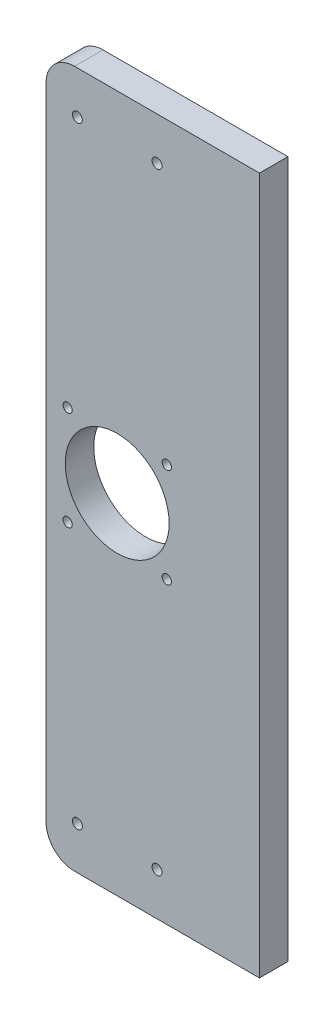
ISO-10303-21;
HEADER;
FILE_DESCRIPTION(('STEP AP214'),'2;1');
FILE_NAME('part.step','',(''),(''),'','','');
FILE_SCHEMA(('AUTOMOTIVE_DESIGN { 1 0 10303 214 1 1 1 1 }'));
ENDSEC;
DATA;
#1=APPLICATION_CONTEXT('core data for automotive mechanical design processes');
#2=APPLICATION_PROTOCOL_DEFINITION('international standard','automotive_design',2000,#1);
#3=PRODUCT_CONTEXT('',#1,'mechanical');
#4=PRODUCT('Part','Part','',(#3));
#5=PRODUCT_RELATED_PRODUCT_CATEGORY('part','',(#4));
#6=PRODUCT_DEFINITION_FORMATION('','',#4);
#7=PRODUCT_DEFINITION_CONTEXT('part definition',#1,'design');
#8=PRODUCT_DEFINITION('design','',#6,#7);
#9=PRODUCT_DEFINITION_SHAPE('','',#8);
#10=(LENGTH_UNIT() NAMED_UNIT(*) SI_UNIT(.MILLI.,.METRE.));
#11=(NAMED_UNIT(*) PLANE_ANGLE_UNIT() SI_UNIT($,.RADIAN.));
#12=(NAMED_UNIT(*) SI_UNIT($,.STERADIAN.) SOLID_ANGLE_UNIT());
#13=UNCERTAINTY_MEASURE_WITH_UNIT(LENGTH_MEASURE(1.E-05),#10,'distance_accuracy_value','');
#14=(GEOMETRIC_REPRESENTATION_CONTEXT(3) GLOBAL_UNCERTAINTY_ASSIGNED_CONTEXT((#13)) GLOBAL_UNIT_ASSIGNED_CONTEXT((#10,
#11,#12)) REPRESENTATION_CONTEXT('',''));
#15=CARTESIAN_POINT('',(0.,0.,0.));
#16=DIRECTION('',(0.,0.,1.));
#17=DIRECTION('',(1.,0.,0.));
#18=AXIS2_PLACEMENT_3D('',#15,#16,#17);
#19=CARTESIAN_POINT('',(100.,0.,20.));
#20=DIRECTION('',(1.,0.,0.));
#21=DIRECTION('',(0.,0.,-1.));
#22=AXIS2_PLACEMENT_3D('',#19,#20,#21);
#23=PLANE('',#22);
#24=DIRECTION('',(0.,-1.,0.));
#25=VECTOR('',#24,1.);
#26=CARTESIAN_POINT('',(100.,0.,0.));
#27=LINE('',#26,#25);
#28=CARTESIAN_POINT('',(100.,245.,0.));
#29=VERTEX_POINT('',#28);
#30=CARTESIAN_POINT('',(100.,-245.,0.));
#31=VERTEX_POINT('',#30);
#32=EDGE_CURVE('E104',#29,#31,#27,.T.);
#33=ORIENTED_EDGE('',*,*,#32,.F.);
#34=DIRECTION('',(0.,0.,-1.));
#35=VECTOR('',#34,1.);
#36=CARTESIAN_POINT('',(100.,245.,20.));
#37=LINE('',#36,#35);
#38=CARTESIAN_POINT('',(100.,245.,20.));
#39=VERTEX_POINT('',#38);
#40=EDGE_CURVE('E92',#39,#29,#37,.T.);
#41=ORIENTED_EDGE('',*,*,#40,.F.);
#42=DIRECTION('',(0.,-1.,0.));
#43=VECTOR('',#42,1.);
#44=CARTESIAN_POINT('',(100.,0.,20.));
#45=LINE('',#44,#43);
#46=CARTESIAN_POINT('',(100.,-245.,20.));
#47=VERTEX_POINT('',#46);
#48=EDGE_CURVE('E98',#39,#47,#45,.T.);
#49=ORIENTED_EDGE('',*,*,#48,.T.);
#50=DIRECTION('',(0.,0.,-1.));
#51=VECTOR('',#50,1.);
#52=CARTESIAN_POINT('',(100.,-245.,20.));
#53=LINE('',#52,#51);
#54=EDGE_CURVE('E106',#47,#31,#53,.T.);
#55=ORIENTED_EDGE('',*,*,#54,.T.);
#56=EDGE_LOOP('',(#33,#41,#49,#55));
#57=FACE_BOUND('',#56,.T.);
#58=ADVANCED_FACE('F37',(#57),#23,.T.);
#59=CARTESIAN_POINT('',(0.,245.,20.));
#60=DIRECTION('',(0.,1.,0.));
#61=DIRECTION('',(0.,0.,1.));
#62=AXIS2_PLACEMENT_3D('',#59,#60,#61);
#63=PLANE('',#62);
#64=DIRECTION('',(1.,0.,0.));
#65=VECTOR('',#64,1.);
#66=CARTESIAN_POINT('',(0.,245.,0.));
#67=LINE('',#66,#65);
#68=CARTESIAN_POINT('',(-30.,245.,0.));
#69=VERTEX_POINT('',#68);
#70=EDGE_CURVE('E150',#69,#29,#67,.T.);
#71=ORIENTED_EDGE('',*,*,#70,.F.);
#72=DIRECTION('',(0.,0.,-1.));
#73=VECTOR('',#72,1.);
#74=CARTESIAN_POINT('',(-30.,245.,20.));
#75=LINE('',#74,#73);
#76=CARTESIAN_POINT('',(-30.,245.,20.));
#77=VERTEX_POINT('',#76);
#78=EDGE_CURVE('E11',#69,#77,#75,.F.);
#79=ORIENTED_EDGE('',*,*,#78,.T.);
#80=DIRECTION('',(1.,0.,0.));
#81=VECTOR('',#80,1.);
#82=CARTESIAN_POINT('',(0.,245.,20.));
#83=LINE('',#82,#81);
#84=EDGE_CURVE('E89',#77,#39,#83,.T.);
#85=ORIENTED_EDGE('',*,*,#84,.T.);
#86=ORIENTED_EDGE('',*,*,#40,.T.);
#87=EDGE_LOOP('',(#71,#79,#85,#86));
#88=FACE_BOUND('',#87,.T.);
#89=ADVANCED_FACE('F91',(#88),#63,.T.);
#90=CARTESIAN_POINT('',(-50.,0.,20.));
#91=DIRECTION('',(1.,0.,0.));
#92=DIRECTION('',(0.,0.,-1.));
#93=AXIS2_PLACEMENT_3D('',#90,#91,#92);
#94=PLANE('',#93);
#95=DIRECTION('',(0.,-1.,0.));
#96=VECTOR('',#95,1.);
#97=CARTESIAN_POINT('',(-50.,0.,0.));
#98=LINE('',#97,#96);
#99=CARTESIAN_POINT('',(-50.,225.,0.));
#100=VERTEX_POINT('',#99);
#101=CARTESIAN_POINT('',(-50.,-225.,0.));
#102=VERTEX_POINT('',#101);
#103=EDGE_CURVE('E152',#100,#102,#98,.T.);
#104=ORIENTED_EDGE('',*,*,#103,.T.);
#105=DIRECTION('',(0.,0.,-1.));
#106=VECTOR('',#105,1.);
#107=CARTESIAN_POINT('',(-50.,-225.,20.));
#108=LINE('',#107,#106);
#109=CARTESIAN_POINT('',(-50.,-225.,20.));
#110=VERTEX_POINT('',#109);
#111=EDGE_CURVE('E58',#102,#110,#108,.F.);
#112=ORIENTED_EDGE('',*,*,#111,.T.);
#113=DIRECTION('',(0.,-1.,0.));
#114=VECTOR('',#113,1.);
#115=CARTESIAN_POINT('',(-50.,0.,20.));
#116=LINE('',#115,#114);
#117=CARTESIAN_POINT('',(-50.,225.,20.));
#118=VERTEX_POINT('',#117);
#119=EDGE_CURVE('E97',#118,#110,#116,.T.);
#120=ORIENTED_EDGE('',*,*,#119,.F.);
#121=DIRECTION('',(0.,0.,-1.));
#122=VECTOR('',#121,1.);
#123=CARTESIAN_POINT('',(-50.,225.,0.));
#124=LINE('',#123,#122);
#125=EDGE_CURVE('E170',#118,#100,#124,.T.);
#126=ORIENTED_EDGE('',*,*,#125,.T.);
#127=EDGE_LOOP('',(#104,#112,#120,#126));
#128=FACE_BOUND('',#127,.T.);
#129=ADVANCED_FACE('F186',(#128),#94,.F.);
#130=CARTESIAN_POINT('',(28.,-215.,20.));
#131=DIRECTION('',(0.,0.,-1.));
#132=DIRECTION('',(-1.,0.,0.));
#133=AXIS2_PLACEMENT_3D('',#130,#131,#132);
#134=CYLINDRICAL_SURFACE('',#133,3.5);
#135=CARTESIAN_POINT('',(28.,-215.,20.));
#136=DIRECTION('',(0.,0.,1.));
#137=DIRECTION('',(1.,0.,0.));
#138=AXIS2_PLACEMENT_3D('',#135,#136,#137);
#139=CIRCLE('',#138,3.5);
#140=CARTESIAN_POINT('',(31.5,-215.,20.));
#141=VERTEX_POINT('',#140);
#142=EDGE_CURVE('E122',#141,#141,#139,.T.);
#143=ORIENTED_EDGE('',*,*,#142,.T.);
#144=EDGE_LOOP('',(#143));
#145=FACE_BOUND('',#144,.T.);
#146=CARTESIAN_POINT('',(28.,-215.,0.));
#147=DIRECTION('',(0.,0.,1.));
#148=DIRECTION('',(1.,0.,0.));
#149=AXIS2_PLACEMENT_3D('',#146,#147,#148);
#150=CIRCLE('',#149,3.5);
#151=CARTESIAN_POINT('',(31.5,-215.,0.));
#152=VERTEX_POINT('',#151);
#153=EDGE_CURVE('E156',#152,#152,#150,.T.);
#154=ORIENTED_EDGE('',*,*,#153,.F.);
#155=EDGE_LOOP('',(#154));
#156=FACE_BOUND('',#155,.T.);
#157=ADVANCED_FACE('F265',(#145,#156),#134,.F.);
#158=CARTESIAN_POINT('',(0.,-245.,20.));
#159=DIRECTION('',(0.,1.,0.));
#160=DIRECTION('',(0.,0.,1.));
#161=AXIS2_PLACEMENT_3D('',#158,#159,#160);
#162=PLANE('',#161);
#163=DIRECTION('',(1.,0.,0.));
#164=VECTOR('',#163,1.);
#165=CARTESIAN_POINT('',(0.,-245.,20.));
#166=LINE('',#165,#164);
#167=CARTESIAN_POINT('',(-30.,-245.,20.));
#168=VERTEX_POINT('',#167);
#169=EDGE_CURVE('E111',#168,#47,#166,.T.);
#170=ORIENTED_EDGE('',*,*,#169,.F.);
#171=DIRECTION('',(0.,0.,-1.));
#172=VECTOR('',#171,1.);
#173=CARTESIAN_POINT('',(-30.,-245.,20.));
#174=LINE('',#173,#172);
#175=CARTESIAN_POINT('',(-30.,-245.,0.));
#176=VERTEX_POINT('',#175);
#177=EDGE_CURVE('E105',#168,#176,#174,.T.);
#178=ORIENTED_EDGE('',*,*,#177,.T.);
#179=DIRECTION('',(1.,0.,0.));
#180=VECTOR('',#179,1.);
#181=CARTESIAN_POINT('',(0.,-245.,0.));
#182=LINE('',#181,#180);
#183=EDGE_CURVE('E154',#176,#31,#182,.T.);
#184=ORIENTED_EDGE('',*,*,#183,.T.);
#185=ORIENTED_EDGE('',*,*,#54,.F.);
#186=EDGE_LOOP('',(#170,#178,#184,#185));
#187=FACE_BOUND('',#186,.T.);
#188=ADVANCED_FACE('F179',(#187),#162,.F.);
#189=CARTESIAN_POINT('',(-28.,215.,20.));
#190=DIRECTION('',(0.,0.,-1.));
#191=DIRECTION('',(-1.,0.,0.));
#192=AXIS2_PLACEMENT_3D('',#189,#190,#191);
#193=CYLINDRICAL_SURFACE('',#192,3.5);
#194=CARTESIAN_POINT('',(-28.,215.,20.));
#195=DIRECTION('',(0.,0.,1.));
#196=DIRECTION('',(1.,0.,0.));
#197=AXIS2_PLACEMENT_3D('',#194,#195,#196);
#198=CIRCLE('',#197,3.5);
#199=CARTESIAN_POINT('',(-24.5,215.,20.));
#200=VERTEX_POINT('',#199);
#201=EDGE_CURVE('E113',#200,#200,#198,.T.);
#202=ORIENTED_EDGE('',*,*,#201,.T.);
#203=EDGE_LOOP('',(#202));
#204=FACE_BOUND('',#203,.T.);
#205=CARTESIAN_POINT('',(-28.,215.,0.));
#206=DIRECTION('',(0.,0.,1.));
#207=DIRECTION('',(1.,0.,0.));
#208=AXIS2_PLACEMENT_3D('',#205,#206,#207);
#209=CIRCLE('',#208,3.5);
#210=CARTESIAN_POINT('',(-24.5,215.,0.));
#211=VERTEX_POINT('',#210);
#212=EDGE_CURVE('E146',#211,#211,#209,.T.);
#213=ORIENTED_EDGE('',*,*,#212,.F.);
#214=EDGE_LOOP('',(#213));
#215=FACE_BOUND('',#214,.T.);
#216=ADVANCED_FACE('F201',(#204,#215),#193,.F.);
#217=CARTESIAN_POINT('',(28.,215.,20.));
#218=DIRECTION('',(0.,0.,-1.));
#219=DIRECTION('',(-1.,0.,0.));
#220=AXIS2_PLACEMENT_3D('',#217,#218,#219);
#221=CYLINDRICAL_SURFACE('',#220,3.5);
#222=CARTESIAN_POINT('',(28.,215.,20.));
#223=DIRECTION('',(0.,0.,1.));
#224=DIRECTION('',(1.,0.,0.));
#225=AXIS2_PLACEMENT_3D('',#222,#223,#224);
#226=CIRCLE('',#225,3.5);
#227=CARTESIAN_POINT('',(31.5,215.,20.));
#228=VERTEX_POINT('',#227);
#229=EDGE_CURVE('E116',#228,#228,#226,.F.);
#230=ORIENTED_EDGE('',*,*,#229,.F.);
#231=EDGE_LOOP('',(#230));
#232=FACE_BOUND('',#231,.T.);
#233=CARTESIAN_POINT('',(28.,215.,0.));
#234=DIRECTION('',(0.,0.,1.));
#235=DIRECTION('',(1.,0.,0.));
#236=AXIS2_PLACEMENT_3D('',#233,#234,#235);
#237=CIRCLE('',#236,3.5);
#238=CARTESIAN_POINT('',(31.5,215.,0.));
#239=VERTEX_POINT('',#238);
#240=EDGE_CURVE('E143',#239,#239,#237,.F.);
#241=ORIENTED_EDGE('',*,*,#240,.T.);
#242=EDGE_LOOP('',(#241));
#243=FACE_BOUND('',#242,.T.);
#244=ADVANCED_FACE('F204',(#232,#243),#221,.F.);
#245=CARTESIAN_POINT('',(0.,0.,20.));
#246=DIRECTION('',(0.,0.,-1.));
#247=DIRECTION('',(-1.,0.,0.));
#248=AXIS2_PLACEMENT_3D('',#245,#246,#247);
#249=CYLINDRICAL_SURFACE('',#248,36.5);
#250=CARTESIAN_POINT('',(0.,0.,20.));
#251=DIRECTION('',(0.,0.,1.));
#252=DIRECTION('',(1.,0.,0.));
#253=AXIS2_PLACEMENT_3D('',#250,#251,#252);
#254=CIRCLE('',#253,36.5);
#255=CARTESIAN_POINT('',(36.5,0.,20.));
#256=VERTEX_POINT('',#255);
#257=EDGE_CURVE('E395',#256,#256,#254,.T.);
#258=ORIENTED_EDGE('',*,*,#257,.T.);
#259=EDGE_LOOP('',(#258));
#260=FACE_BOUND('',#259,.T.);
#261=CARTESIAN_POINT('',(0.,0.,0.));
#262=DIRECTION('',(0.,0.,1.));
#263=DIRECTION('',(1.,0.,0.));
#264=AXIS2_PLACEMENT_3D('',#261,#262,#263);
#265=CIRCLE('',#264,36.5);
#266=CARTESIAN_POINT('',(36.5,0.,0.));
#267=VERTEX_POINT('',#266);
#268=EDGE_CURVE('E140',#267,#267,#265,.T.);
#269=ORIENTED_EDGE('',*,*,#268,.F.);
#270=EDGE_LOOP('',(#269));
#271=FACE_BOUND('',#270,.T.);
#272=ADVANCED_FACE('F208',(#260,#271),#249,.F.);
#273=CARTESIAN_POINT('',(-34.8499999999996,34.85,20.));
#274=DIRECTION('',(0.,0.,-1.));
#275=DIRECTION('',(-1.,0.,0.));
#276=AXIS2_PLACEMENT_3D('',#273,#274,#275);
#277=CYLINDRICAL_SURFACE('',#276,3.25);
#278=CARTESIAN_POINT('',(-34.8499999999996,34.85,20.));
#279=DIRECTION('',(0.,0.,1.));
#280=DIRECTION('',(1.,0.,0.));
#281=AXIS2_PLACEMENT_3D('',#278,#279,#280);
#282=CIRCLE('',#281,3.25);
#283=CARTESIAN_POINT('',(-31.5999999999996,34.85,20.));
#284=VERTEX_POINT('',#283);
#285=EDGE_CURVE('E391',#284,#284,#282,.T.);
#286=ORIENTED_EDGE('',*,*,#285,.T.);
#287=EDGE_LOOP('',(#286));
#288=FACE_BOUND('',#287,.T.);
#289=CARTESIAN_POINT('',(-34.8499999999996,34.85,0.));
#290=DIRECTION('',(0.,0.,1.));
#291=DIRECTION('',(1.,0.,0.));
#292=AXIS2_PLACEMENT_3D('',#289,#290,#291);
#293=CIRCLE('',#292,3.25);
#294=CARTESIAN_POINT('',(-31.5999999999996,34.85,0.));
#295=VERTEX_POINT('',#294);
#296=EDGE_CURVE('E137',#295,#295,#293,.T.);
#297=ORIENTED_EDGE('',*,*,#296,.F.);
#298=EDGE_LOOP('',(#297));
#299=FACE_BOUND('',#298,.T.);
#300=ADVANCED_FACE('F212',(#288,#299),#277,.F.);
#301=CARTESIAN_POINT('',(34.8499999999996,34.85,20.));
#302=DIRECTION('',(0.,0.,-1.));
#303=DIRECTION('',(-1.,0.,0.));
#304=AXIS2_PLACEMENT_3D('',#301,#302,#303);
#305=CYLINDRICAL_SURFACE('',#304,3.25);
#306=CARTESIAN_POINT('',(34.8499999999996,34.85,20.));
#307=DIRECTION('',(0.,0.,1.));
#308=DIRECTION('',(1.,0.,0.));
#309=AXIS2_PLACEMENT_3D('',#306,#307,#308);
#310=CIRCLE('',#309,3.25);
#311=CARTESIAN_POINT('',(38.0999999999996,34.85,20.));
#312=VERTEX_POINT('',#311);
#313=EDGE_CURVE('E387',#312,#312,#310,.T.);
#314=ORIENTED_EDGE('',*,*,#313,.T.);
#315=EDGE_LOOP('',(#314));
#316=FACE_BOUND('',#315,.T.);
#317=CARTESIAN_POINT('',(34.8499999999996,34.85,0.));
#318=DIRECTION('',(0.,0.,1.));
#319=DIRECTION('',(1.,0.,0.));
#320=AXIS2_PLACEMENT_3D('',#317,#318,#319);
#321=CIRCLE('',#320,3.25);
#322=CARTESIAN_POINT('',(38.0999999999996,34.85,0.));
#323=VERTEX_POINT('',#322);
#324=EDGE_CURVE('E134',#323,#323,#321,.T.);
#325=ORIENTED_EDGE('',*,*,#324,.F.);
#326=EDGE_LOOP('',(#325));
#327=FACE_BOUND('',#326,.T.);
#328=ADVANCED_FACE('F216',(#316,#327),#305,.F.);
#329=CARTESIAN_POINT('',(34.8499999999996,-34.85,20.));
#330=DIRECTION('',(0.,0.,-1.));
#331=DIRECTION('',(-1.,0.,0.));
#332=AXIS2_PLACEMENT_3D('',#329,#330,#331);
#333=CYLINDRICAL_SURFACE('',#332,3.25);
#334=CARTESIAN_POINT('',(34.8499999999996,-34.85,20.));
#335=DIRECTION('',(0.,0.,1.));
#336=DIRECTION('',(1.,0.,0.));
#337=AXIS2_PLACEMENT_3D('',#334,#335,#336);
#338=CIRCLE('',#337,3.25);
#339=CARTESIAN_POINT('',(38.0999999999996,-34.85,20.));
#340=VERTEX_POINT('',#339);
#341=EDGE_CURVE('E383',#340,#340,#338,.T.);
#342=ORIENTED_EDGE('',*,*,#341,.T.);
#343=EDGE_LOOP('',(#342));
#344=FACE_BOUND('',#343,.T.);
#345=CARTESIAN_POINT('',(34.8499999999996,-34.85,0.));
#346=DIRECTION('',(0.,0.,1.));
#347=DIRECTION('',(1.,0.,0.));
#348=AXIS2_PLACEMENT_3D('',#345,#346,#347);
#349=CIRCLE('',#348,3.25);
#350=CARTESIAN_POINT('',(38.0999999999996,-34.85,0.));
#351=VERTEX_POINT('',#350);
#352=EDGE_CURVE('E131',#351,#351,#349,.T.);
#353=ORIENTED_EDGE('',*,*,#352,.F.);
#354=EDGE_LOOP('',(#353));
#355=FACE_BOUND('',#354,.T.);
#356=ADVANCED_FACE('F220',(#344,#355),#333,.F.);
#357=CARTESIAN_POINT('',(-34.8499999999996,-34.85,20.));
#358=DIRECTION('',(0.,0.,-1.));
#359=DIRECTION('',(-1.,0.,0.));
#360=AXIS2_PLACEMENT_3D('',#357,#358,#359);
#361=CYLINDRICAL_SURFACE('',#360,3.25);
#362=CARTESIAN_POINT('',(-34.8499999999996,-34.85,20.));
#363=DIRECTION('',(0.,0.,1.));
#364=DIRECTION('',(1.,0.,0.));
#365=AXIS2_PLACEMENT_3D('',#362,#363,#364);
#366=CIRCLE('',#365,3.25);
#367=CARTESIAN_POINT('',(-31.5999999999996,-34.85,20.));
#368=VERTEX_POINT('',#367);
#369=EDGE_CURVE('E162',#368,#368,#366,.T.);
#370=ORIENTED_EDGE('',*,*,#369,.T.);
#371=EDGE_LOOP('',(#370));
#372=FACE_BOUND('',#371,.T.);
#373=CARTESIAN_POINT('',(-34.8499999999996,-34.85,0.));
#374=DIRECTION('',(0.,0.,1.));
#375=DIRECTION('',(1.,0.,0.));
#376=AXIS2_PLACEMENT_3D('',#373,#374,#375);
#377=CIRCLE('',#376,3.25);
#378=CARTESIAN_POINT('',(-31.5999999999996,-34.85,0.));
#379=VERTEX_POINT('',#378);
#380=EDGE_CURVE('E128',#379,#379,#377,.T.);
#381=ORIENTED_EDGE('',*,*,#380,.F.);
#382=EDGE_LOOP('',(#381));
#383=FACE_BOUND('',#382,.T.);
#384=ADVANCED_FACE('F224',(#372,#383),#361,.F.);
#385=CARTESIAN_POINT('',(-28.,-215.,20.));
#386=DIRECTION('',(0.,0.,-1.));
#387=DIRECTION('',(-1.,0.,0.));
#388=AXIS2_PLACEMENT_3D('',#385,#386,#387);
#389=CYLINDRICAL_SURFACE('',#388,3.49999999999999);
#390=CARTESIAN_POINT('',(-28.,-215.,20.));
#391=DIRECTION('',(0.,0.,1.));
#392=DIRECTION('',(1.,0.,0.));
#393=AXIS2_PLACEMENT_3D('',#390,#391,#392);
#394=CIRCLE('',#393,3.49999999999999);
#395=CARTESIAN_POINT('',(-24.5,-215.,20.));
#396=VERTEX_POINT('',#395);
#397=EDGE_CURVE('E125',#396,#396,#394,.F.);
#398=ORIENTED_EDGE('',*,*,#397,.F.);
#399=EDGE_LOOP('',(#398));
#400=FACE_BOUND('',#399,.T.);
#401=CARTESIAN_POINT('',(-28.,-215.,0.));
#402=DIRECTION('',(0.,0.,1.));
#403=DIRECTION('',(1.,0.,0.));
#404=AXIS2_PLACEMENT_3D('',#401,#402,#403);
#405=CIRCLE('',#404,3.49999999999999);
#406=CARTESIAN_POINT('',(-24.5,-215.,0.));
#407=VERTEX_POINT('',#406);
#408=EDGE_CURVE('E159',#407,#407,#405,.F.);
#409=ORIENTED_EDGE('',*,*,#408,.T.);
#410=EDGE_LOOP('',(#409));
#411=FACE_BOUND('',#410,.T.);
#412=ADVANCED_FACE('F227',(#400,#411),#389,.F.);
#413=CARTESIAN_POINT('',(0.,0.,20.));
#414=DIRECTION('',(0.,0.,1.));
#415=DIRECTION('',(1.,0.,0.));
#416=AXIS2_PLACEMENT_3D('',#413,#414,#415);
#417=PLANE('',#416);
#418=ORIENTED_EDGE('',*,*,#369,.F.);
#419=EDGE_LOOP('',(#418));
#420=FACE_BOUND('',#419,.T.);
#421=ORIENTED_EDGE('',*,*,#341,.F.);
#422=EDGE_LOOP('',(#421));
#423=FACE_BOUND('',#422,.T.);
#424=ORIENTED_EDGE('',*,*,#313,.F.);
#425=EDGE_LOOP('',(#424));
#426=FACE_BOUND('',#425,.T.);
#427=ORIENTED_EDGE('',*,*,#285,.F.);
#428=EDGE_LOOP('',(#427));
#429=FACE_BOUND('',#428,.T.);
#430=ORIENTED_EDGE('',*,*,#257,.F.);
#431=EDGE_LOOP('',(#430));
#432=FACE_BOUND('',#431,.T.);
#433=ORIENTED_EDGE('',*,*,#229,.T.);
#434=EDGE_LOOP('',(#433));
#435=FACE_BOUND('',#434,.T.);
#436=ORIENTED_EDGE('',*,*,#201,.F.);
#437=EDGE_LOOP('',(#436));
#438=FACE_BOUND('',#437,.T.);
#439=ORIENTED_EDGE('',*,*,#119,.T.);
#440=CARTESIAN_POINT('',(-30.,-225.,20.));
#441=DIRECTION('',(0.,0.,1.));
#442=DIRECTION('',(1.,0.,0.));
#443=AXIS2_PLACEMENT_3D('',#440,#441,#442);
#444=CIRCLE('',#443,20.);
#445=EDGE_CURVE('E45',#110,#168,#444,.T.);
#446=ORIENTED_EDGE('',*,*,#445,.T.);
#447=ORIENTED_EDGE('',*,*,#169,.T.);
#448=ORIENTED_EDGE('',*,*,#48,.F.);
#449=ORIENTED_EDGE('',*,*,#84,.F.);
#450=CARTESIAN_POINT('',(-30.,225.,20.));
#451=DIRECTION('',(0.,0.,1.));
#452=DIRECTION('',(1.,0.,0.));
#453=AXIS2_PLACEMENT_3D('',#450,#451,#452);
#454=CIRCLE('',#453,20.);
#455=EDGE_CURVE('E174',#77,#118,#454,.T.);
#456=ORIENTED_EDGE('',*,*,#455,.T.);
#457=EDGE_LOOP('',(#439,#446,#447,#448,#449,#456));
#458=FACE_BOUND('',#457,.T.);
#459=ORIENTED_EDGE('',*,*,#142,.F.);
#460=EDGE_LOOP('',(#459));
#461=FACE_BOUND('',#460,.T.);
#462=ORIENTED_EDGE('',*,*,#397,.T.);
#463=EDGE_LOOP('',(#462));
#464=FACE_BOUND('',#463,.T.);
#465=ADVANCED_FACE('F108',(#420,#423,#426,#429,#432,#435,#438,#458,#461,#464),#417,.T.);
#466=CARTESIAN_POINT('',(0.,0.,0.));
#467=DIRECTION('',(0.,0.,1.));
#468=DIRECTION('',(1.,0.,0.));
#469=AXIS2_PLACEMENT_3D('',#466,#467,#468);
#470=PLANE('',#469);
#471=ORIENTED_EDGE('',*,*,#380,.T.);
#472=EDGE_LOOP('',(#471));
#473=FACE_BOUND('',#472,.T.);
#474=ORIENTED_EDGE('',*,*,#352,.T.);
#475=EDGE_LOOP('',(#474));
#476=FACE_BOUND('',#475,.T.);
#477=ORIENTED_EDGE('',*,*,#324,.T.);
#478=EDGE_LOOP('',(#477));
#479=FACE_BOUND('',#478,.T.);
#480=ORIENTED_EDGE('',*,*,#296,.T.);
#481=EDGE_LOOP('',(#480));
#482=FACE_BOUND('',#481,.T.);
#483=ORIENTED_EDGE('',*,*,#268,.T.);
#484=EDGE_LOOP('',(#483));
#485=FACE_BOUND('',#484,.T.);
#486=ORIENTED_EDGE('',*,*,#240,.F.);
#487=EDGE_LOOP('',(#486));
#488=FACE_BOUND('',#487,.T.);
#489=ORIENTED_EDGE('',*,*,#212,.T.);
#490=EDGE_LOOP('',(#489));
#491=FACE_BOUND('',#490,.T.);
#492=ORIENTED_EDGE('',*,*,#183,.F.);
#493=CARTESIAN_POINT('',(-30.,-225.,0.));
#494=DIRECTION('',(0.,0.,1.));
#495=DIRECTION('',(1.,0.,0.));
#496=AXIS2_PLACEMENT_3D('',#493,#494,#495);
#497=CIRCLE('',#496,20.);
#498=EDGE_CURVE('E168',#176,#102,#497,.F.);
#499=ORIENTED_EDGE('',*,*,#498,.T.);
#500=ORIENTED_EDGE('',*,*,#103,.F.);
#501=CARTESIAN_POINT('',(-30.,225.,0.));
#502=DIRECTION('',(0.,0.,1.));
#503=DIRECTION('',(1.,0.,0.));
#504=AXIS2_PLACEMENT_3D('',#501,#502,#503);
#505=CIRCLE('',#504,20.);
#506=EDGE_CURVE('E166',#100,#69,#505,.F.);
#507=ORIENTED_EDGE('',*,*,#506,.T.);
#508=ORIENTED_EDGE('',*,*,#70,.T.);
#509=ORIENTED_EDGE('',*,*,#32,.T.);
#510=EDGE_LOOP('',(#492,#499,#500,#507,#508,#509));
#511=FACE_BOUND('',#510,.T.);
#512=ORIENTED_EDGE('',*,*,#153,.T.);
#513=EDGE_LOOP('',(#512));
#514=FACE_BOUND('',#513,.T.);
#515=ORIENTED_EDGE('',*,*,#408,.F.);
#516=EDGE_LOOP('',(#515));
#517=FACE_BOUND('',#516,.T.);
#518=ADVANCED_FACE('F184',(#473,#476,#479,#482,#485,#488,#491,#511,#514,#517),#470,.F.);
#519=CARTESIAN_POINT('',(-30.,-225.,20.));
#520=DIRECTION('',(0.,0.,-1.));
#521=DIRECTION('',(-1.,0.,0.));
#522=AXIS2_PLACEMENT_3D('',#519,#520,#521);
#523=CYLINDRICAL_SURFACE('',#522,20.);
#524=ORIENTED_EDGE('',*,*,#445,.F.);
#525=ORIENTED_EDGE('',*,*,#111,.F.);
#526=ORIENTED_EDGE('',*,*,#498,.F.);
#527=ORIENTED_EDGE('',*,*,#177,.F.);
#528=EDGE_LOOP('',(#524,#525,#526,#527));
#529=FACE_BOUND('',#528,.T.);
#530=ADVANCED_FACE('F181',(#529),#523,.T.);
#531=CARTESIAN_POINT('',(-30.,225.,20.));
#532=DIRECTION('',(0.,0.,1.));
#533=DIRECTION('',(1.,0.,0.));
#534=AXIS2_PLACEMENT_3D('',#531,#532,#533);
#535=CYLINDRICAL_SURFACE('',#534,20.);
#536=ORIENTED_EDGE('',*,*,#455,.F.);
#537=ORIENTED_EDGE('',*,*,#78,.F.);
#538=ORIENTED_EDGE('',*,*,#506,.F.);
#539=ORIENTED_EDGE('',*,*,#125,.F.);
#540=EDGE_LOOP('',(#536,#537,#538,#539));
#541=FACE_BOUND('',#540,.T.);
#542=ADVANCED_FACE('F39',(#541),#535,.T.);
#543=CLOSED_SHELL('',(#58,#89,#129,#157,#188,#216,#244,#272,#300,#328,#356,#384,#412,#465,#518,
#530,#542));
#544=MANIFOLD_SOLID_BREP('B2',#543);
#545=ADVANCED_BREP_SHAPE_REPRESENTATION('',(#18,#544),#14);
#546=SHAPE_DEFINITION_REPRESENTATION(#9,#545);
ENDSEC;
END-ISO-10303-21;
